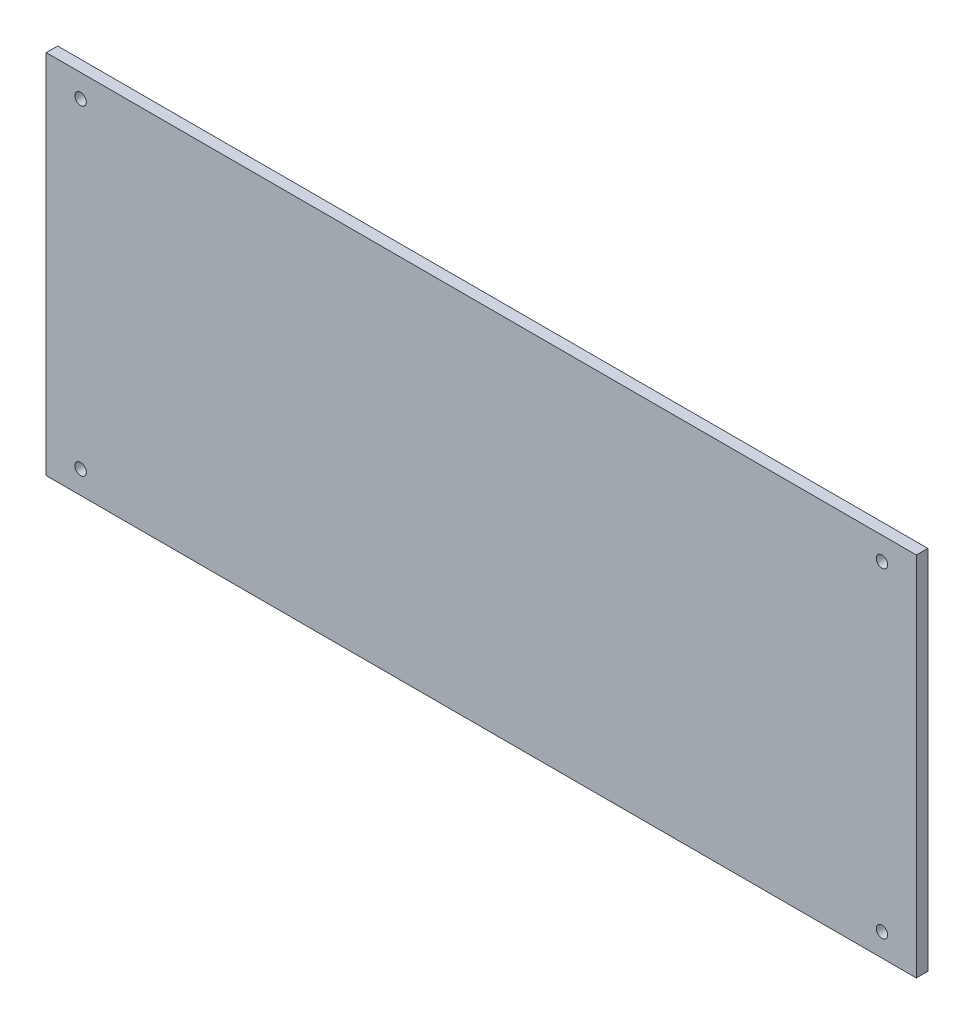
ISO-10303-21;
HEADER;
FILE_DESCRIPTION(('STEP AP214'),'2;1');
FILE_NAME('part.step','',(''),(''),'','','');
FILE_SCHEMA(('AUTOMOTIVE_DESIGN { 1 0 10303 214 1 1 1 1 }'));
ENDSEC;
DATA;
#1=APPLICATION_CONTEXT('core data for automotive mechanical design processes');
#2=APPLICATION_PROTOCOL_DEFINITION('international standard','automotive_design',2000,#1);
#3=PRODUCT_CONTEXT('',#1,'mechanical');
#4=PRODUCT('Part','Part','',(#3));
#5=PRODUCT_RELATED_PRODUCT_CATEGORY('part','',(#4));
#6=PRODUCT_DEFINITION_FORMATION('','',#4);
#7=PRODUCT_DEFINITION_CONTEXT('part definition',#1,'design');
#8=PRODUCT_DEFINITION('design','',#6,#7);
#9=PRODUCT_DEFINITION_SHAPE('','',#8);
#10=(LENGTH_UNIT() NAMED_UNIT(*) SI_UNIT(.MILLI.,.METRE.));
#11=(NAMED_UNIT(*) PLANE_ANGLE_UNIT() SI_UNIT($,.RADIAN.));
#12=(NAMED_UNIT(*) SI_UNIT($,.STERADIAN.) SOLID_ANGLE_UNIT());
#13=UNCERTAINTY_MEASURE_WITH_UNIT(LENGTH_MEASURE(1.E-05),#10,'distance_accuracy_value','');
#14=(GEOMETRIC_REPRESENTATION_CONTEXT(3) GLOBAL_UNCERTAINTY_ASSIGNED_CONTEXT((#13)) GLOBAL_UNIT_ASSIGNED_CONTEXT((#10,
#11,#12)) REPRESENTATION_CONTEXT('',''));
#15=CARTESIAN_POINT('',(0.,0.,0.));
#16=DIRECTION('',(0.,0.,1.));
#17=DIRECTION('',(1.,0.,0.));
#18=AXIS2_PLACEMENT_3D('',#15,#16,#17);
#19=CARTESIAN_POINT('',(241.3,-101.6,6.35));
#20=DIRECTION('',(-1.,0.,0.));
#21=DIRECTION('',(0.,0.,1.));
#22=AXIS2_PLACEMENT_3D('',#19,#20,#21);
#23=PLANE('',#22);
#24=DIRECTION('',(0.,1.,0.));
#25=VECTOR('',#24,1.);
#26=CARTESIAN_POINT('',(241.3,-101.6,0.));
#27=LINE('',#26,#25);
#28=CARTESIAN_POINT('',(241.3,-101.6,0.));
#29=VERTEX_POINT('',#28);
#30=CARTESIAN_POINT('',(241.3,101.6,0.));
#31=VERTEX_POINT('',#30);
#32=EDGE_CURVE('E110',#29,#31,#27,.T.);
#33=ORIENTED_EDGE('',*,*,#32,.T.);
#34=DIRECTION('',(0.,0.,-1.));
#35=VECTOR('',#34,1.);
#36=CARTESIAN_POINT('',(241.3,101.6,6.35));
#37=LINE('',#36,#35);
#38=CARTESIAN_POINT('',(241.3,101.6,6.35));
#39=VERTEX_POINT('',#38);
#40=EDGE_CURVE('E11',#39,#31,#37,.T.);
#41=ORIENTED_EDGE('',*,*,#40,.F.);
#42=DIRECTION('',(0.,1.,0.));
#43=VECTOR('',#42,1.);
#44=CARTESIAN_POINT('',(241.3,-101.6,6.35));
#45=LINE('',#44,#43);
#46=CARTESIAN_POINT('',(241.3,-101.6,6.35));
#47=VERTEX_POINT('',#46);
#48=EDGE_CURVE('E94',#47,#39,#45,.T.);
#49=ORIENTED_EDGE('',*,*,#48,.F.);
#50=DIRECTION('',(0.,0.,-1.));
#51=VECTOR('',#50,1.);
#52=CARTESIAN_POINT('',(241.3,-101.6,6.35));
#53=LINE('',#52,#51);
#54=EDGE_CURVE('E106',#47,#29,#53,.T.);
#55=ORIENTED_EDGE('',*,*,#54,.T.);
#56=EDGE_LOOP('',(#33,#41,#49,#55));
#57=FACE_BOUND('',#56,.T.);
#58=ADVANCED_FACE('F42',(#57),#23,.F.);
#59=CARTESIAN_POINT('',(-241.3,101.6,6.35));
#60=DIRECTION('',(0.,-1.,0.));
#61=DIRECTION('',(0.,0.,-1.));
#62=AXIS2_PLACEMENT_3D('',#59,#60,#61);
#63=PLANE('',#62);
#64=DIRECTION('',(-1.,0.,0.));
#65=VECTOR('',#64,1.);
#66=CARTESIAN_POINT('',(-241.3,101.6,0.));
#67=LINE('',#66,#65);
#68=CARTESIAN_POINT('',(-241.3,101.6,0.));
#69=VERTEX_POINT('',#68);
#70=EDGE_CURVE('E99',#31,#69,#67,.T.);
#71=ORIENTED_EDGE('',*,*,#70,.T.);
#72=DIRECTION('',(0.,0.,-1.));
#73=VECTOR('',#72,1.);
#74=CARTESIAN_POINT('',(-241.3,101.6,6.35));
#75=LINE('',#74,#73);
#76=CARTESIAN_POINT('',(-241.3,101.6,6.35));
#77=VERTEX_POINT('',#76);
#78=EDGE_CURVE('E51',#77,#69,#75,.T.);
#79=ORIENTED_EDGE('',*,*,#78,.F.);
#80=DIRECTION('',(-1.,0.,0.));
#81=VECTOR('',#80,1.);
#82=CARTESIAN_POINT('',(-241.3,101.6,6.35));
#83=LINE('',#82,#81);
#84=EDGE_CURVE('E89',#39,#77,#83,.T.);
#85=ORIENTED_EDGE('',*,*,#84,.F.);
#86=ORIENTED_EDGE('',*,*,#40,.T.);
#87=EDGE_LOOP('',(#71,#79,#85,#86));
#88=FACE_BOUND('',#87,.T.);
#89=ADVANCED_FACE('F98',(#88),#63,.F.);
#90=CARTESIAN_POINT('',(-241.3,-101.6,6.35));
#91=DIRECTION('',(1.,0.,0.));
#92=DIRECTION('',(0.,0.,-1.));
#93=AXIS2_PLACEMENT_3D('',#90,#91,#92);
#94=PLANE('',#93);
#95=DIRECTION('',(0.,-1.,0.));
#96=VECTOR('',#95,1.);
#97=CARTESIAN_POINT('',(-241.3,-101.6,0.));
#98=LINE('',#97,#96);
#99=CARTESIAN_POINT('',(-241.3,-101.6,0.));
#100=VERTEX_POINT('',#99);
#101=EDGE_CURVE('E76',#69,#100,#98,.T.);
#102=ORIENTED_EDGE('',*,*,#101,.T.);
#103=DIRECTION('',(0.,0.,-1.));
#104=VECTOR('',#103,1.);
#105=CARTESIAN_POINT('',(-241.3,-101.6,6.35));
#106=LINE('',#105,#104);
#107=CARTESIAN_POINT('',(-241.3,-101.6,6.35));
#108=VERTEX_POINT('',#107);
#109=EDGE_CURVE('E101',#108,#100,#106,.T.);
#110=ORIENTED_EDGE('',*,*,#109,.F.);
#111=DIRECTION('',(0.,-1.,0.));
#112=VECTOR('',#111,1.);
#113=CARTESIAN_POINT('',(-241.3,-101.6,6.35));
#114=LINE('',#113,#112);
#115=EDGE_CURVE('E92',#77,#108,#114,.T.);
#116=ORIENTED_EDGE('',*,*,#115,.F.);
#117=ORIENTED_EDGE('',*,*,#78,.T.);
#118=EDGE_LOOP('',(#102,#110,#116,#117));
#119=FACE_BOUND('',#118,.T.);
#120=ADVANCED_FACE('F102',(#119),#94,.F.);
#121=CARTESIAN_POINT('',(-241.3,-101.6,6.35));
#122=DIRECTION('',(0.,1.,0.));
#123=DIRECTION('',(0.,0.,1.));
#124=AXIS2_PLACEMENT_3D('',#121,#122,#123);
#125=PLANE('',#124);
#126=DIRECTION('',(1.,0.,0.));
#127=VECTOR('',#126,1.);
#128=CARTESIAN_POINT('',(-241.3,-101.6,0.));
#129=LINE('',#128,#127);
#130=EDGE_CURVE('E82',#100,#29,#129,.T.);
#131=ORIENTED_EDGE('',*,*,#130,.T.);
#132=ORIENTED_EDGE('',*,*,#54,.F.);
#133=DIRECTION('',(1.,0.,0.));
#134=VECTOR('',#133,1.);
#135=CARTESIAN_POINT('',(-241.3,-101.6,6.35));
#136=LINE('',#135,#134);
#137=EDGE_CURVE('E59',#108,#47,#136,.T.);
#138=ORIENTED_EDGE('',*,*,#137,.F.);
#139=ORIENTED_EDGE('',*,*,#109,.T.);
#140=EDGE_LOOP('',(#131,#132,#138,#139));
#141=FACE_BOUND('',#140,.T.);
#142=ADVANCED_FACE('F124',(#141),#125,.F.);
#143=CARTESIAN_POINT('',(0.,0.,6.35));
#144=DIRECTION('',(0.,0.,-1.));
#145=DIRECTION('',(-1.,0.,0.));
#146=AXIS2_PLACEMENT_3D('',#143,#144,#145);
#147=PLANE('',#146);
#148=CARTESIAN_POINT('',(222.25,88.9,6.35));
#149=DIRECTION('',(0.,0.,1.));
#150=DIRECTION('',(-1.,0.,0.));
#151=AXIS2_PLACEMENT_3D('',#148,#149,#150);
#152=CIRCLE('',#151,3.175);
#153=CARTESIAN_POINT('',(219.075,88.9,6.35));
#154=VERTEX_POINT('',#153);
#155=EDGE_CURVE('E155',#154,#154,#152,.T.);
#156=ORIENTED_EDGE('',*,*,#155,.F.);
#157=EDGE_LOOP('',(#156));
#158=FACE_BOUND('',#157,.T.);
#159=CARTESIAN_POINT('',(222.25,-88.9,6.35));
#160=DIRECTION('',(0.,0.,-1.));
#161=DIRECTION('',(-1.,0.,0.));
#162=AXIS2_PLACEMENT_3D('',#159,#160,#161);
#163=CIRCLE('',#162,3.175);
#164=CARTESIAN_POINT('',(219.075,-88.9,6.35));
#165=VERTEX_POINT('',#164);
#166=EDGE_CURVE('E147',#165,#165,#163,.T.);
#167=ORIENTED_EDGE('',*,*,#166,.T.);
#168=EDGE_LOOP('',(#167));
#169=FACE_BOUND('',#168,.T.);
#170=CARTESIAN_POINT('',(-222.25,88.9,6.35));
#171=DIRECTION('',(0.,0.,-1.));
#172=DIRECTION('',(1.,0.,0.));
#173=AXIS2_PLACEMENT_3D('',#170,#171,#172);
#174=CIRCLE('',#173,3.175);
#175=CARTESIAN_POINT('',(-219.075,88.9,6.35));
#176=VERTEX_POINT('',#175);
#177=EDGE_CURVE('E139',#176,#176,#174,.T.);
#178=ORIENTED_EDGE('',*,*,#177,.T.);
#179=EDGE_LOOP('',(#178));
#180=FACE_BOUND('',#179,.T.);
#181=CARTESIAN_POINT('',(-222.25,-88.9,6.35));
#182=DIRECTION('',(0.,0.,1.));
#183=DIRECTION('',(1.,0.,0.));
#184=AXIS2_PLACEMENT_3D('',#181,#182,#183);
#185=CIRCLE('',#184,3.175);
#186=CARTESIAN_POINT('',(-219.075,-88.9,6.35));
#187=VERTEX_POINT('',#186);
#188=EDGE_CURVE('E131',#187,#187,#185,.T.);
#189=ORIENTED_EDGE('',*,*,#188,.F.);
#190=EDGE_LOOP('',(#189));
#191=FACE_BOUND('',#190,.T.);
#192=ORIENTED_EDGE('',*,*,#48,.T.);
#193=ORIENTED_EDGE('',*,*,#84,.T.);
#194=ORIENTED_EDGE('',*,*,#115,.T.);
#195=ORIENTED_EDGE('',*,*,#137,.T.);
#196=EDGE_LOOP('',(#192,#193,#194,#195));
#197=FACE_BOUND('',#196,.T.);
#198=ADVANCED_FACE('F90',(#158,#169,#180,#191,#197),#147,.F.);
#199=CARTESIAN_POINT('',(0.,0.,0.));
#200=DIRECTION('',(0.,0.,-1.));
#201=DIRECTION('',(-1.,0.,0.));
#202=AXIS2_PLACEMENT_3D('',#199,#200,#201);
#203=PLANE('',#202);
#204=CARTESIAN_POINT('',(222.25,88.9,0.));
#205=DIRECTION('',(0.,0.,1.));
#206=DIRECTION('',(-1.,0.,0.));
#207=AXIS2_PLACEMENT_3D('',#204,#205,#206);
#208=CIRCLE('',#207,3.175);
#209=CARTESIAN_POINT('',(219.075,88.9,0.));
#210=VERTEX_POINT('',#209);
#211=EDGE_CURVE('E151',#210,#210,#208,.T.);
#212=ORIENTED_EDGE('',*,*,#211,.T.);
#213=EDGE_LOOP('',(#212));
#214=FACE_BOUND('',#213,.T.);
#215=CARTESIAN_POINT('',(222.25,-88.9,0.));
#216=DIRECTION('',(0.,0.,-1.));
#217=DIRECTION('',(-1.,0.,0.));
#218=AXIS2_PLACEMENT_3D('',#215,#216,#217);
#219=CIRCLE('',#218,3.175);
#220=CARTESIAN_POINT('',(219.075,-88.9,0.));
#221=VERTEX_POINT('',#220);
#222=EDGE_CURVE('E143',#221,#221,#219,.T.);
#223=ORIENTED_EDGE('',*,*,#222,.F.);
#224=EDGE_LOOP('',(#223));
#225=FACE_BOUND('',#224,.T.);
#226=CARTESIAN_POINT('',(-222.25,88.9,0.));
#227=DIRECTION('',(0.,0.,-1.));
#228=DIRECTION('',(1.,0.,0.));
#229=AXIS2_PLACEMENT_3D('',#226,#227,#228);
#230=CIRCLE('',#229,3.175);
#231=CARTESIAN_POINT('',(-219.075,88.9,0.));
#232=VERTEX_POINT('',#231);
#233=EDGE_CURVE('E135',#232,#232,#230,.T.);
#234=ORIENTED_EDGE('',*,*,#233,.F.);
#235=EDGE_LOOP('',(#234));
#236=FACE_BOUND('',#235,.T.);
#237=CARTESIAN_POINT('',(-222.25,-88.9,0.));
#238=DIRECTION('',(0.,0.,1.));
#239=DIRECTION('',(1.,0.,0.));
#240=AXIS2_PLACEMENT_3D('',#237,#238,#239);
#241=CIRCLE('',#240,3.175);
#242=CARTESIAN_POINT('',(-219.075,-88.9,0.));
#243=VERTEX_POINT('',#242);
#244=EDGE_CURVE('E114',#243,#243,#241,.T.);
#245=ORIENTED_EDGE('',*,*,#244,.T.);
#246=EDGE_LOOP('',(#245));
#247=FACE_BOUND('',#246,.T.);
#248=ORIENTED_EDGE('',*,*,#32,.F.);
#249=ORIENTED_EDGE('',*,*,#130,.F.);
#250=ORIENTED_EDGE('',*,*,#101,.F.);
#251=ORIENTED_EDGE('',*,*,#70,.F.);
#252=EDGE_LOOP('',(#248,#249,#250,#251));
#253=FACE_BOUND('',#252,.T.);
#254=ADVANCED_FACE('F127',(#214,#225,#236,#247,#253),#203,.T.);
#255=CARTESIAN_POINT('',(-222.25,-88.9,0.));
#256=DIRECTION('',(0.,0.,1.));
#257=DIRECTION('',(1.,0.,0.));
#258=AXIS2_PLACEMENT_3D('',#255,#256,#257);
#259=CYLINDRICAL_SURFACE('',#258,3.175);
#260=ORIENTED_EDGE('',*,*,#244,.F.);
#261=EDGE_LOOP('',(#260));
#262=FACE_BOUND('',#261,.T.);
#263=ORIENTED_EDGE('',*,*,#188,.T.);
#264=EDGE_LOOP('',(#263));
#265=FACE_BOUND('',#264,.T.);
#266=ADVANCED_FACE('F181',(#262,#265),#259,.F.);
#267=CARTESIAN_POINT('',(-222.25,88.9,0.));
#268=DIRECTION('',(0.,0.,1.));
#269=DIRECTION('',(1.,0.,0.));
#270=AXIS2_PLACEMENT_3D('',#267,#268,#269);
#271=CYLINDRICAL_SURFACE('',#270,3.175);
#272=ORIENTED_EDGE('',*,*,#233,.T.);
#273=EDGE_LOOP('',(#272));
#274=FACE_BOUND('',#273,.T.);
#275=ORIENTED_EDGE('',*,*,#177,.F.);
#276=EDGE_LOOP('',(#275));
#277=FACE_BOUND('',#276,.T.);
#278=ADVANCED_FACE('F183',(#274,#277),#271,.F.);
#279=CARTESIAN_POINT('',(222.25,-88.9,0.));
#280=DIRECTION('',(0.,0.,1.));
#281=DIRECTION('',(1.,0.,0.));
#282=AXIS2_PLACEMENT_3D('',#279,#280,#281);
#283=CYLINDRICAL_SURFACE('',#282,3.175);
#284=ORIENTED_EDGE('',*,*,#222,.T.);
#285=EDGE_LOOP('',(#284));
#286=FACE_BOUND('',#285,.T.);
#287=ORIENTED_EDGE('',*,*,#166,.F.);
#288=EDGE_LOOP('',(#287));
#289=FACE_BOUND('',#288,.T.);
#290=ADVANCED_FACE('F168',(#286,#289),#283,.F.);
#291=CARTESIAN_POINT('',(222.25,88.9,0.));
#292=DIRECTION('',(0.,0.,1.));
#293=DIRECTION('',(1.,0.,0.));
#294=AXIS2_PLACEMENT_3D('',#291,#292,#293);
#295=CYLINDRICAL_SURFACE('',#294,3.175);
#296=ORIENTED_EDGE('',*,*,#211,.F.);
#297=EDGE_LOOP('',(#296));
#298=FACE_BOUND('',#297,.T.);
#299=ORIENTED_EDGE('',*,*,#155,.T.);
#300=EDGE_LOOP('',(#299));
#301=FACE_BOUND('',#300,.T.);
#302=ADVANCED_FACE('F165',(#298,#301),#295,.F.);
#303=CLOSED_SHELL('',(#58,#89,#120,#142,#198,#254,#266,#278,#290,#302));
#304=MANIFOLD_SOLID_BREP('B2',#303);
#305=ADVANCED_BREP_SHAPE_REPRESENTATION('',(#18,#304),#14);
#306=SHAPE_DEFINITION_REPRESENTATION(#9,#305);
ENDSEC;
END-ISO-10303-21;
